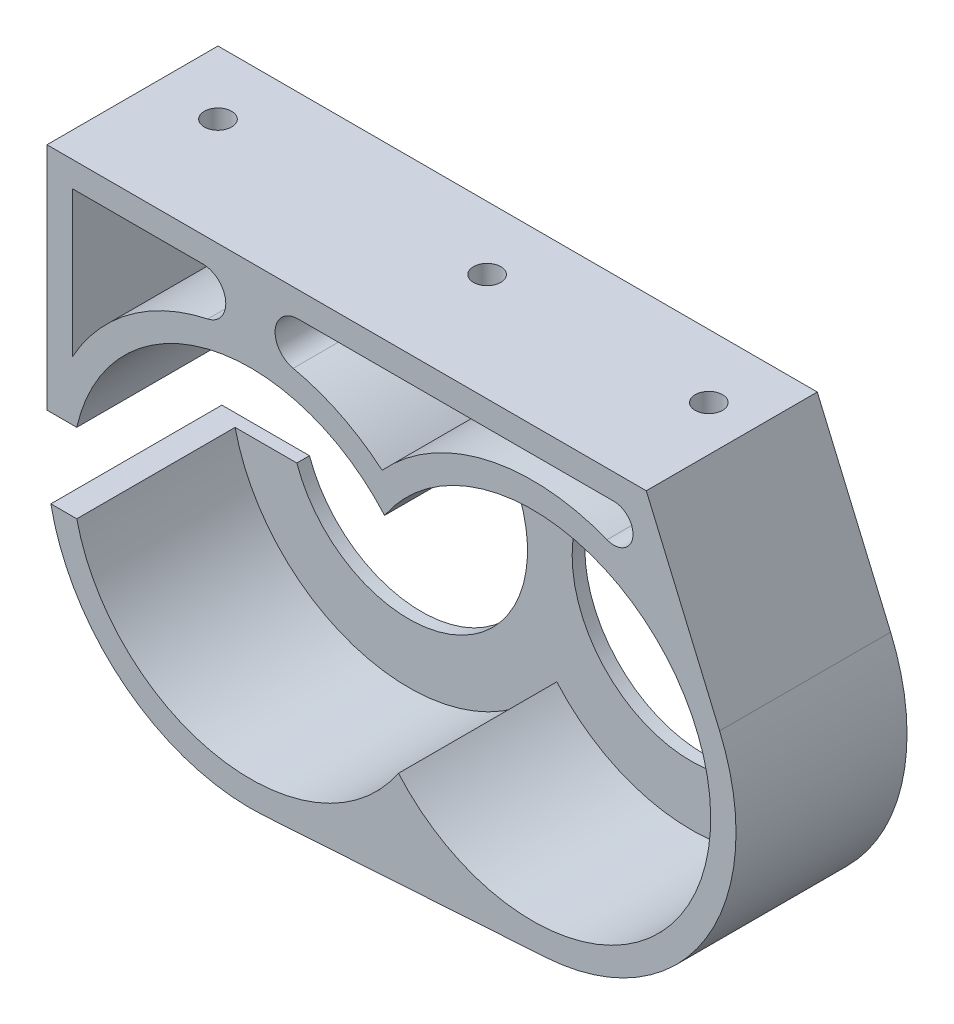
ISO-10303-21;
HEADER;
FILE_DESCRIPTION(('STEP AP214'),'2;1');
FILE_NAME('part.step','',(''),(''),'','','');
FILE_SCHEMA(('AUTOMOTIVE_DESIGN { 1 0 10303 214 1 1 1 1 }'));
ENDSEC;
DATA;
#1=APPLICATION_CONTEXT('core data for automotive mechanical design processes');
#2=APPLICATION_PROTOCOL_DEFINITION('international standard','automotive_design',2000,#1);
#3=PRODUCT_CONTEXT('',#1,'mechanical');
#4=PRODUCT('Part','Part','',(#3));
#5=PRODUCT_RELATED_PRODUCT_CATEGORY('part','',(#4));
#6=PRODUCT_DEFINITION_FORMATION('','',#4);
#7=PRODUCT_DEFINITION_CONTEXT('part definition',#1,'design');
#8=PRODUCT_DEFINITION('design','',#6,#7);
#9=PRODUCT_DEFINITION_SHAPE('','',#8);
#10=(LENGTH_UNIT() NAMED_UNIT(*) SI_UNIT(.MILLI.,.METRE.));
#11=(NAMED_UNIT(*) PLANE_ANGLE_UNIT() SI_UNIT($,.RADIAN.));
#12=(NAMED_UNIT(*) SI_UNIT($,.STERADIAN.) SOLID_ANGLE_UNIT());
#13=UNCERTAINTY_MEASURE_WITH_UNIT(LENGTH_MEASURE(1.E-05),#10,'distance_accuracy_value','');
#14=(GEOMETRIC_REPRESENTATION_CONTEXT(3) GLOBAL_UNCERTAINTY_ASSIGNED_CONTEXT((#13)) GLOBAL_UNIT_ASSIGNED_CONTEXT((#10,
#11,#12)) REPRESENTATION_CONTEXT('',''));
#15=CARTESIAN_POINT('',(0.,0.,0.));
#16=DIRECTION('',(0.,0.,1.));
#17=DIRECTION('',(1.,0.,0.));
#18=AXIS2_PLACEMENT_3D('',#15,#16,#17);
#19=CARTESIAN_POINT('',(0.,0.,20.));
#20=DIRECTION('',(0.,0.,-1.));
#21=DIRECTION('',(-1.,0.,0.));
#22=AXIS2_PLACEMENT_3D('',#19,#20,#21);
#23=CYLINDRICAL_SURFACE('',#22,22.5);
#24=DIRECTION('',(0.,0.,-1.));
#25=VECTOR('',#24,1.);
#26=CARTESIAN_POINT('',(-21.9374109684803,-4.99999999999999,20.));
#27=LINE('',#26,#25);
#28=CARTESIAN_POINT('',(-21.9374109684803,-4.99999999999999,0.));
#29=VERTEX_POINT('',#28);
#30=CARTESIAN_POINT('',(-21.9374109684803,-4.99999999999999,20.));
#31=VERTEX_POINT('',#30);
#32=EDGE_CURVE('E517',#29,#31,#27,.F.);
#33=ORIENTED_EDGE('',*,*,#32,.T.);
#34=CARTESIAN_POINT('',(0.,0.,20.));
#35=DIRECTION('',(0.,0.,1.));
#36=DIRECTION('',(1.,0.,0.));
#37=AXIS2_PLACEMENT_3D('',#34,#35,#36);
#38=CIRCLE('',#37,22.5);
#39=CARTESIAN_POINT('',(18.6946924526454,-12.520322443971,20.));
#40=VERTEX_POINT('',#39);
#41=EDGE_CURVE('E415',#31,#40,#38,.T.);
#42=ORIENTED_EDGE('',*,*,#41,.T.);
#43=DIRECTION('',(0.,0.,-1.));
#44=VECTOR('',#43,1.);
#45=CARTESIAN_POINT('',(18.6946924526454,-12.520322443971,20.));
#46=LINE('',#45,#44);
#47=CARTESIAN_POINT('',(18.6946924526454,-12.520322443971,0.));
#48=VERTEX_POINT('',#47);
#49=EDGE_CURVE('E350',#40,#48,#46,.T.);
#50=ORIENTED_EDGE('',*,*,#49,.T.);
#51=CARTESIAN_POINT('',(0.,0.,0.));
#52=DIRECTION('',(0.,0.,1.));
#53=DIRECTION('',(1.,0.,0.));
#54=AXIS2_PLACEMENT_3D('',#51,#52,#53);
#55=CIRCLE('',#54,22.5);
#56=EDGE_CURVE('E368',#29,#48,#55,.T.);
#57=ORIENTED_EDGE('',*,*,#56,.F.);
#58=EDGE_LOOP('',(#33,#42,#50,#57));
#59=FACE_BOUND('',#58,.T.);
#60=ADVANCED_FACE('F47',(#59),#23,.F.);
#61=CARTESIAN_POINT('',(0.,0.,20.));
#62=DIRECTION('',(0.,0.,1.));
#63=DIRECTION('',(1.,0.,0.));
#64=AXIS2_PLACEMENT_3D('',#61,#62,#63);
#65=PLANE('',#64);
#66=DIRECTION('',(-1.,0.,0.));
#67=VECTOR('',#66,1.);
#68=CARTESIAN_POINT('',(0.,-5.,20.));
#69=LINE('',#68,#67);
#70=CARTESIAN_POINT('',(-25.2089269902549,-4.99999999999999,20.));
#71=VERTEX_POINT('',#70);
#72=EDGE_CURVE('E553',#31,#71,#69,.T.);
#73=ORIENTED_EDGE('',*,*,#72,.T.);
#74=CARTESIAN_POINT('',(0.,0.,20.));
#75=DIRECTION('',(0.,0.,1.));
#76=DIRECTION('',(1.,0.,0.));
#77=AXIS2_PLACEMENT_3D('',#74,#75,#76);
#78=CIRCLE('',#77,25.7);
#79=CARTESIAN_POINT('',(1.64559871785401,-25.6472611570865,20.));
#80=VERTEX_POINT('',#79);
#81=EDGE_CURVE('E423',#71,#80,#78,.T.);
#82=ORIENTED_EDGE('',*,*,#81,.T.);
#83=DIRECTION('',(-0.997947904945,-0.0640310785157203,0.));
#84=VECTOR('',#83,1.);
#85=CARTESIAN_POINT('',(1.64559871785401,-25.6472611570865,20.));
#86=LINE('',#85,#84);
#87=CARTESIAN_POINT('',(37.281598717854,-23.360757520294,20.));
#88=VERTEX_POINT('',#87);
#89=EDGE_CURVE('E427',#88,#80,#86,.T.);
#90=ORIENTED_EDGE('',*,*,#89,.F.);
#91=CARTESIAN_POINT('',(35.636,2.28650363679251,20.));
#92=DIRECTION('',(0.,0.,1.));
#93=DIRECTION('',(1.,0.,0.));
#94=AXIS2_PLACEMENT_3D('',#91,#92,#93);
#95=CIRCLE('',#94,25.7);
#96=CARTESIAN_POINT('',(59.2620434294652,12.40085343641,20.));
#97=VERTEX_POINT('',#96);
#98=EDGE_CURVE('E434',#88,#97,#95,.T.);
#99=ORIENTED_EDGE('',*,*,#98,.T.);
#100=DIRECTION('',(-0.393554466911185,0.919301300757403,0.));
#101=VECTOR('',#100,1.);
#102=CARTESIAN_POINT('',(54.5698032374247,23.3614265582556,20.));
#103=LINE('',#102,#101);
#104=CARTESIAN_POINT('',(49.9999999999999,34.036,20.));
#105=VERTEX_POINT('',#104);
#106=EDGE_CURVE('E437',#97,#105,#103,.T.);
#107=ORIENTED_EDGE('',*,*,#106,.T.);
#108=DIRECTION('',(1.,0.,0.));
#109=VECTOR('',#108,1.);
#110=CARTESIAN_POINT('',(0.,34.036,20.));
#111=LINE('',#110,#109);
#112=CARTESIAN_POINT('',(-25.7,34.036,20.));
#113=VERTEX_POINT('',#112);
#114=EDGE_CURVE('E351',#113,#105,#111,.T.);
#115=ORIENTED_EDGE('',*,*,#114,.F.);
#116=DIRECTION('',(0.,-1.,0.));
#117=VECTOR('',#116,1.);
#118=CARTESIAN_POINT('',(-25.7,0.,20.));
#119=LINE('',#118,#117);
#120=CARTESIAN_POINT('',(-25.7,5.,20.));
#121=VERTEX_POINT('',#120);
#122=EDGE_CURVE('E414',#113,#121,#119,.T.);
#123=ORIENTED_EDGE('',*,*,#122,.T.);
#124=DIRECTION('',(1.,0.,0.));
#125=VECTOR('',#124,1.);
#126=CARTESIAN_POINT('',(-25.7,5.,20.));
#127=LINE('',#126,#125);
#128=CARTESIAN_POINT('',(-21.9374109684803,5.,20.));
#129=VERTEX_POINT('',#128);
#130=EDGE_CURVE('E393',#121,#129,#127,.T.);
#131=ORIENTED_EDGE('',*,*,#130,.T.);
#132=CARTESIAN_POINT('',(16.9413075473542,14.8068260807629,20.));
#133=VERTEX_POINT('',#132);
#134=EDGE_CURVE('E410',#133,#129,#38,.T.);
#135=ORIENTED_EDGE('',*,*,#134,.F.);
#136=CARTESIAN_POINT('',(35.636,2.28650363679251,20.));
#137=DIRECTION('',(0.,0.,1.));
#138=DIRECTION('',(1.,0.,0.));
#139=AXIS2_PLACEMENT_3D('',#136,#137,#138);
#140=CIRCLE('',#139,22.5000000000003);
#141=EDGE_CURVE('E367',#40,#133,#140,.T.);
#142=ORIENTED_EDGE('',*,*,#141,.F.);
#143=ORIENTED_EDGE('',*,*,#41,.F.);
#144=EDGE_LOOP('',(#73,#82,#90,#99,#107,#115,#123,#131,#135,#142,#143));
#145=FACE_BOUND('',#144,.T.);
#146=CARTESIAN_POINT('',(35.6359999999999,2.28650363679251,20.));
#147=DIRECTION('',(0.,0.,1.));
#148=DIRECTION('',(1.,0.,0.));
#149=AXIS2_PLACEMENT_3D('',#146,#147,#148);
#150=CIRCLE('',#149,25.7000000000003);
#151=CARTESIAN_POINT('',(45.0440158622167,26.2025910579468,20.));
#152=VERTEX_POINT('',#151);
#153=CARTESIAN_POINT('',(16.6343740371481,19.5904977065988,20.));
#154=VERTEX_POINT('',#153);
#155=EDGE_CURVE('E586',#152,#154,#150,.T.);
#156=ORIENTED_EDGE('',*,*,#155,.T.);
#157=CARTESIAN_POINT('',(0.,0.,20.));
#158=DIRECTION('',(0.,0.,1.));
#159=DIRECTION('',(1.,0.,0.));
#160=AXIS2_PLACEMENT_3D('',#157,#158,#159);
#161=CIRCLE('',#160,25.7);
#162=CARTESIAN_POINT('',(5.39417699902875,25.1275318028482,20.));
#163=VERTEX_POINT('',#162);
#164=EDGE_CURVE('E581',#154,#163,#161,.T.);
#165=ORIENTED_EDGE('',*,*,#164,.T.);
#166=CARTESIAN_POINT('',(6.00000000000002,27.9496187915664,20.));
#167=DIRECTION('',(0.,0.,1.));
#168=DIRECTION('',(1.,0.,0.));
#169=AXIS2_PLACEMENT_3D('',#166,#167,#168);
#170=CIRCLE('',#169,2.88638120843358);
#171=CARTESIAN_POINT('',(6.00000000000001,30.836,20.));
#172=VERTEX_POINT('',#171);
#173=EDGE_CURVE('E291',#172,#163,#170,.T.);
#174=ORIENTED_EDGE('',*,*,#173,.F.);
#175=DIRECTION('',(-1.,0.,0.));
#176=VECTOR('',#175,1.);
#177=CARTESIAN_POINT('',(0.,30.836,20.));
#178=LINE('',#177,#176);
#179=CARTESIAN_POINT('',(45.9225854368984,30.8360000000001,20.));
#180=VERTEX_POINT('',#179);
#181=EDGE_CURVE('E599',#180,#172,#178,.T.);
#182=ORIENTED_EDGE('',*,*,#181,.F.);
#183=CARTESIAN_POINT('',(45.9225854368984,28.4360000000001,20.));
#184=DIRECTION('',(0.,0.,1.));
#185=DIRECTION('',(1.,0.,0.));
#186=AXIS2_PLACEMENT_3D('',#183,#184,#185);
#187=CIRCLE('',#186,2.4);
#188=EDGE_CURVE('E676',#180,#152,#187,.F.);
#189=ORIENTED_EDGE('',*,*,#188,.T.);
#190=EDGE_LOOP('',(#156,#165,#174,#182,#189));
#191=FACE_BOUND('',#190,.T.);
#192=CARTESIAN_POINT('',(-5.99999999999998,27.9496187915664,20.));
#193=DIRECTION('',(0.,0.,1.));
#194=DIRECTION('',(1.,0.,0.));
#195=AXIS2_PLACEMENT_3D('',#192,#193,#194);
#196=CIRCLE('',#195,2.88638120843361);
#197=CARTESIAN_POINT('',(-5.99999999999999,30.8360000000001,20.));
#198=VERTEX_POINT('',#197);
#199=CARTESIAN_POINT('',(-5.39417699902872,25.1275318028482,20.));
#200=VERTEX_POINT('',#199);
#201=EDGE_CURVE('E636',#198,#200,#196,.F.);
#202=ORIENTED_EDGE('',*,*,#201,.T.);
#203=CARTESIAN_POINT('',(0.,0.,20.));
#204=DIRECTION('',(0.,0.,1.));
#205=DIRECTION('',(1.,0.,0.));
#206=AXIS2_PLACEMENT_3D('',#203,#204,#205);
#207=CIRCLE('',#206,25.7);
#208=CARTESIAN_POINT('',(-22.5,12.419339757008,20.));
#209=VERTEX_POINT('',#208);
#210=EDGE_CURVE('E631',#200,#209,#207,.T.);
#211=ORIENTED_EDGE('',*,*,#210,.T.);
#212=DIRECTION('',(0.,-1.,0.));
#213=VECTOR('',#212,1.);
#214=CARTESIAN_POINT('',(-22.5,0.,20.));
#215=LINE('',#214,#213);
#216=CARTESIAN_POINT('',(-22.5,30.836,20.));
#217=VERTEX_POINT('',#216);
#218=EDGE_CURVE('E640',#217,#209,#215,.T.);
#219=ORIENTED_EDGE('',*,*,#218,.F.);
#220=DIRECTION('',(-1.,0.,0.));
#221=VECTOR('',#220,1.);
#222=CARTESIAN_POINT('',(-1.29456311047789E-13,30.8360000000001,20.));
#223=LINE('',#222,#221);
#224=EDGE_CURVE('E645',#198,#217,#223,.T.);
#225=ORIENTED_EDGE('',*,*,#224,.F.);
#226=EDGE_LOOP('',(#202,#211,#219,#225));
#227=FACE_BOUND('',#226,.T.);
#228=ADVANCED_FACE('F453',(#145,#191,#227),#65,.T.);
#229=CARTESIAN_POINT('',(0.,0.,-1.6));
#230=DIRECTION('',(0.,0.,-1.));
#231=DIRECTION('',(-1.,0.,0.));
#232=AXIS2_PLACEMENT_3D('',#229,#230,#231);
#233=PLANE('',#232);
#234=CARTESIAN_POINT('',(35.636000000002,2.28650363678922,-1.6));
#235=DIRECTION('',(0.,0.,-1.));
#236=DIRECTION('',(-1.,0.,0.));
#237=AXIS2_PLACEMENT_3D('',#234,#235,#236);
#238=CIRCLE('',#237,15.);
#239=CARTESIAN_POINT('',(20.636000000002,2.28650363678922,-1.6));
#240=VERTEX_POINT('',#239);
#241=EDGE_CURVE('E795',#240,#240,#238,.T.);
#242=ORIENTED_EDGE('',*,*,#241,.F.);
#243=EDGE_LOOP('',(#242));
#244=FACE_BOUND('',#243,.T.);
#245=CARTESIAN_POINT('',(0.,0.,-1.6));
#246=DIRECTION('',(0.,0.,-1.));
#247=DIRECTION('',(-1.,0.,0.));
#248=AXIS2_PLACEMENT_3D('',#245,#246,#247);
#249=CIRCLE('',#248,15.);
#250=CARTESIAN_POINT('',(-14.142135623731,5.,-1.6));
#251=VERTEX_POINT('',#250);
#252=CARTESIAN_POINT('',(-14.142135623731,-5.,-1.6));
#253=VERTEX_POINT('',#252);
#254=EDGE_CURVE('E535',#251,#253,#249,.T.);
#255=ORIENTED_EDGE('',*,*,#254,.F.);
#256=DIRECTION('',(1.,0.,0.));
#257=VECTOR('',#256,1.);
#258=CARTESIAN_POINT('',(-25.7,5.,-1.6));
#259=LINE('',#258,#257);
#260=CARTESIAN_POINT('',(-25.7,5.,-1.6));
#261=VERTEX_POINT('',#260);
#262=EDGE_CURVE('E529',#261,#251,#259,.T.);
#263=ORIENTED_EDGE('',*,*,#262,.F.);
#264=DIRECTION('',(0.,1.,0.));
#265=VECTOR('',#264,1.);
#266=CARTESIAN_POINT('',(-25.7,0.,-1.6));
#267=LINE('',#266,#265);
#268=CARTESIAN_POINT('',(-25.7,34.036,-1.6));
#269=VERTEX_POINT('',#268);
#270=EDGE_CURVE('E475',#261,#269,#267,.T.);
#271=ORIENTED_EDGE('',*,*,#270,.T.);
#272=DIRECTION('',(1.,0.,0.));
#273=VECTOR('',#272,1.);
#274=CARTESIAN_POINT('',(-25.7,34.036,-1.6));
#275=LINE('',#274,#273);
#276=CARTESIAN_POINT('',(49.9999999999999,34.036,-1.6));
#277=VERTEX_POINT('',#276);
#278=EDGE_CURVE('E469',#269,#277,#275,.T.);
#279=ORIENTED_EDGE('',*,*,#278,.T.);
#280=DIRECTION('',(0.393554466911185,-0.919301300757403,0.));
#281=VECTOR('',#280,1.);
#282=CARTESIAN_POINT('',(49.9999999999999,34.036,-1.6));
#283=LINE('',#282,#281);
#284=CARTESIAN_POINT('',(59.2620434294652,12.40085343641,-1.6));
#285=VERTEX_POINT('',#284);
#286=EDGE_CURVE('E463',#277,#285,#283,.T.);
#287=ORIENTED_EDGE('',*,*,#286,.T.);
#288=CARTESIAN_POINT('',(35.636000000002,2.28650363678922,-1.6));
#289=DIRECTION('',(0.,0.,-1.));
#290=DIRECTION('',(-1.,0.,0.));
#291=AXIS2_PLACEMENT_3D('',#288,#289,#290);
#292=CIRCLE('',#291,25.6999999999997);
#293=CARTESIAN_POINT('',(37.2815987178535,-23.3607575202972,-1.6));
#294=VERTEX_POINT('',#293);
#295=EDGE_CURVE('E468',#285,#294,#292,.T.);
#296=ORIENTED_EDGE('',*,*,#295,.T.);
#297=DIRECTION('',(-0.997947904945006,-0.0640310785156249,0.));
#298=VECTOR('',#297,1.);
#299=CARTESIAN_POINT('',(37.2815987178535,-23.3607575202974,-1.6));
#300=LINE('',#299,#298);
#301=CARTESIAN_POINT('',(1.64559871785156,-25.6472611570866,-1.6));
#302=VERTEX_POINT('',#301);
#303=EDGE_CURVE('E473',#294,#302,#300,.T.);
#304=ORIENTED_EDGE('',*,*,#303,.T.);
#305=CARTESIAN_POINT('',(0.,0.,-1.6));
#306=DIRECTION('',(0.,0.,-1.));
#307=DIRECTION('',(-1.,0.,0.));
#308=AXIS2_PLACEMENT_3D('',#305,#306,#307);
#309=CIRCLE('',#308,25.7);
#310=CARTESIAN_POINT('',(-25.2089269902549,-4.99999999999999,-1.6));
#311=VERTEX_POINT('',#310);
#312=EDGE_CURVE('E697',#302,#311,#309,.T.);
#313=ORIENTED_EDGE('',*,*,#312,.T.);
#314=DIRECTION('',(-1.,0.,0.));
#315=VECTOR('',#314,1.);
#316=CARTESIAN_POINT('',(0.,-5.,-1.6));
#317=LINE('',#316,#315);
#318=EDGE_CURVE('E552',#253,#311,#317,.T.);
#319=ORIENTED_EDGE('',*,*,#318,.F.);
#320=EDGE_LOOP('',(#255,#263,#271,#279,#287,#296,#304,#313,#319));
#321=FACE_BOUND('',#320,.T.);
#322=CARTESIAN_POINT('',(6.00000000000002,27.9496187915664,-1.6));
#323=DIRECTION('',(0.,0.,-1.));
#324=DIRECTION('',(-1.,0.,0.));
#325=AXIS2_PLACEMENT_3D('',#322,#323,#324);
#326=CIRCLE('',#325,2.88638120843358);
#327=CARTESIAN_POINT('',(6.00000000000001,30.836,-1.6));
#328=VERTEX_POINT('',#327);
#329=CARTESIAN_POINT('',(5.39417699902875,25.1275318028482,-1.6));
#330=VERTEX_POINT('',#329);
#331=EDGE_CURVE('E573',#328,#330,#326,.F.);
#332=ORIENTED_EDGE('',*,*,#331,.T.);
#333=CARTESIAN_POINT('',(0.,0.,-1.6));
#334=DIRECTION('',(0.,0.,-1.));
#335=DIRECTION('',(-1.,0.,0.));
#336=AXIS2_PLACEMENT_3D('',#333,#334,#335);
#337=CIRCLE('',#336,25.7);
#338=CARTESIAN_POINT('',(16.6343740371481,19.5904977065988,-1.6));
#339=VERTEX_POINT('',#338);
#340=EDGE_CURVE('E577',#339,#330,#337,.F.);
#341=ORIENTED_EDGE('',*,*,#340,.F.);
#342=CARTESIAN_POINT('',(35.6359999999999,2.28650363679251,-1.6));
#343=DIRECTION('',(0.,0.,-1.));
#344=DIRECTION('',(-1.,0.,0.));
#345=AXIS2_PLACEMENT_3D('',#342,#343,#344);
#346=CIRCLE('',#345,25.7000000000003);
#347=CARTESIAN_POINT('',(45.0440158622167,26.2025910579468,-1.6));
#348=VERTEX_POINT('',#347);
#349=EDGE_CURVE('E602',#348,#339,#346,.F.);
#350=ORIENTED_EDGE('',*,*,#349,.F.);
#351=CARTESIAN_POINT('',(45.9225854368984,28.4360000000001,-1.6));
#352=DIRECTION('',(0.,0.,-1.));
#353=DIRECTION('',(-1.,0.,0.));
#354=AXIS2_PLACEMENT_3D('',#351,#352,#353);
#355=CIRCLE('',#354,2.4);
#356=CARTESIAN_POINT('',(45.9225854368984,30.8360000000001,-1.6));
#357=VERTEX_POINT('',#356);
#358=EDGE_CURVE('E398',#357,#348,#355,.T.);
#359=ORIENTED_EDGE('',*,*,#358,.F.);
#360=DIRECTION('',(-1.,0.,0.));
#361=VECTOR('',#360,1.);
#362=CARTESIAN_POINT('',(0.,30.836,-1.6));
#363=LINE('',#362,#361);
#364=EDGE_CURVE('E271',#357,#328,#363,.T.);
#365=ORIENTED_EDGE('',*,*,#364,.T.);
#366=EDGE_LOOP('',(#332,#341,#350,#359,#365));
#367=FACE_BOUND('',#366,.T.);
#368=DIRECTION('',(0.,-1.,0.));
#369=VECTOR('',#368,1.);
#370=CARTESIAN_POINT('',(-22.5,0.,-1.6));
#371=LINE('',#370,#369);
#372=CARTESIAN_POINT('',(-22.5,30.836,-1.6));
#373=VERTEX_POINT('',#372);
#374=CARTESIAN_POINT('',(-22.5,12.419339757008,-1.6));
#375=VERTEX_POINT('',#374);
#376=EDGE_CURVE('E622',#373,#375,#371,.T.);
#377=ORIENTED_EDGE('',*,*,#376,.T.);
#378=CARTESIAN_POINT('',(0.,0.,-1.6));
#379=DIRECTION('',(0.,0.,-1.));
#380=DIRECTION('',(-1.,0.,0.));
#381=AXIS2_PLACEMENT_3D('',#378,#379,#380);
#382=CIRCLE('',#381,25.7);
#383=CARTESIAN_POINT('',(-5.39417699902872,25.1275318028482,-1.6));
#384=VERTEX_POINT('',#383);
#385=EDGE_CURVE('E627',#384,#375,#382,.F.);
#386=ORIENTED_EDGE('',*,*,#385,.F.);
#387=CARTESIAN_POINT('',(-5.99999999999998,27.9496187915664,-1.6));
#388=DIRECTION('',(0.,0.,-1.));
#389=DIRECTION('',(-1.,0.,0.));
#390=AXIS2_PLACEMENT_3D('',#387,#388,#389);
#391=CIRCLE('',#390,2.88638120843361);
#392=CARTESIAN_POINT('',(-5.99999999999999,30.836,-1.6));
#393=VERTEX_POINT('',#392);
#394=EDGE_CURVE('E567',#393,#384,#391,.T.);
#395=ORIENTED_EDGE('',*,*,#394,.F.);
#396=DIRECTION('',(-1.,0.,0.));
#397=VECTOR('',#396,1.);
#398=CARTESIAN_POINT('',(-1.29456311047789E-13,30.8360000000001,-1.6));
#399=LINE('',#398,#397);
#400=EDGE_CURVE('E399',#393,#373,#399,.T.);
#401=ORIENTED_EDGE('',*,*,#400,.T.);
#402=EDGE_LOOP('',(#377,#386,#395,#401));
#403=FACE_BOUND('',#402,.T.);
#404=ADVANCED_FACE('F693',(#244,#321,#367,#403),#233,.T.);
#405=CARTESIAN_POINT('',(-25.7,0.,20.));
#406=DIRECTION('',(1.,0.,0.));
#407=DIRECTION('',(0.,1.,0.));
#408=AXIS2_PLACEMENT_3D('',#405,#406,#407);
#409=PLANE('',#408);
#410=ORIENTED_EDGE('',*,*,#270,.F.);
#411=DIRECTION('',(0.,0.,-1.));
#412=VECTOR('',#411,1.);
#413=CARTESIAN_POINT('',(-25.7,5.,20.001));
#414=LINE('',#413,#412);
#415=EDGE_CURVE('E386',#121,#261,#414,.T.);
#416=ORIENTED_EDGE('',*,*,#415,.F.);
#417=ORIENTED_EDGE('',*,*,#122,.F.);
#418=DIRECTION('',(0.,0.,-1.));
#419=VECTOR('',#418,1.);
#420=CARTESIAN_POINT('',(-25.7,34.036,20.));
#421=LINE('',#420,#419);
#422=EDGE_CURVE('E330',#113,#269,#421,.T.);
#423=ORIENTED_EDGE('',*,*,#422,.T.);
#424=EDGE_LOOP('',(#410,#416,#417,#423));
#425=FACE_BOUND('',#424,.T.);
#426=ADVANCED_FACE('F704',(#425),#409,.F.);
#427=CARTESIAN_POINT('',(0.,0.,20.));
#428=DIRECTION('',(0.,0.,-1.));
#429=DIRECTION('',(-1.,0.,0.));
#430=AXIS2_PLACEMENT_3D('',#427,#428,#429);
#431=CYLINDRICAL_SURFACE('',#430,25.7);
#432=ORIENTED_EDGE('',*,*,#81,.F.);
#433=DIRECTION('',(0.,0.,-1.));
#434=VECTOR('',#433,1.);
#435=CARTESIAN_POINT('',(-25.2089269902549,-4.99999999999999,20.001));
#436=LINE('',#435,#434);
#437=EDGE_CURVE('E385',#71,#311,#436,.T.);
#438=ORIENTED_EDGE('',*,*,#437,.T.);
#439=ORIENTED_EDGE('',*,*,#312,.F.);
#440=DIRECTION('',(0.,0.,-1.));
#441=VECTOR('',#440,1.);
#442=CARTESIAN_POINT('',(1.64559871785401,-25.6472611570865,20.));
#443=LINE('',#442,#441);
#444=EDGE_CURVE('E58',#80,#302,#443,.T.);
#445=ORIENTED_EDGE('',*,*,#444,.F.);
#446=EDGE_LOOP('',(#432,#438,#439,#445));
#447=FACE_BOUND('',#446,.T.);
#448=ADVANCED_FACE('F713',(#447),#431,.T.);
#449=CARTESIAN_POINT('',(1.64559871785401,-25.6472611570865,20.));
#450=DIRECTION('',(0.0640310785157202,-0.997947904944999,0.));
#451=DIRECTION('',(0.997947904945,0.0640310785157202,0.));
#452=AXIS2_PLACEMENT_3D('',#449,#450,#451);
#453=PLANE('',#452);
#454=ORIENTED_EDGE('',*,*,#444,.T.);
#455=ORIENTED_EDGE('',*,*,#303,.F.);
#456=DIRECTION('',(0.,0.,-1.));
#457=VECTOR('',#456,1.);
#458=CARTESIAN_POINT('',(37.281598717854,-23.360757520294,20.));
#459=LINE('',#458,#457);
#460=EDGE_CURVE('E336',#88,#294,#459,.T.);
#461=ORIENTED_EDGE('',*,*,#460,.F.);
#462=ORIENTED_EDGE('',*,*,#89,.T.);
#463=EDGE_LOOP('',(#454,#455,#461,#462));
#464=FACE_BOUND('',#463,.T.);
#465=ADVANCED_FACE('F754',(#464),#453,.T.);
#466=CARTESIAN_POINT('',(35.636,2.28650363679251,20.));
#467=DIRECTION('',(0.,0.,-1.));
#468=DIRECTION('',(-1.,0.,0.));
#469=AXIS2_PLACEMENT_3D('',#466,#467,#468);
#470=CYLINDRICAL_SURFACE('',#469,25.7);
#471=ORIENTED_EDGE('',*,*,#460,.T.);
#472=ORIENTED_EDGE('',*,*,#295,.F.);
#473=DIRECTION('',(0.,0.,-1.));
#474=VECTOR('',#473,1.);
#475=CARTESIAN_POINT('',(59.2620434294652,12.40085343641,20.));
#476=LINE('',#475,#474);
#477=EDGE_CURVE('E329',#97,#285,#476,.T.);
#478=ORIENTED_EDGE('',*,*,#477,.F.);
#479=ORIENTED_EDGE('',*,*,#98,.F.);
#480=EDGE_LOOP('',(#471,#472,#478,#479));
#481=FACE_BOUND('',#480,.T.);
#482=ADVANCED_FACE('F749',(#481),#470,.T.);
#483=CARTESIAN_POINT('',(54.5698032374247,23.3614265582556,20.));
#484=DIRECTION('',(-0.919301300757403,-0.393554466911185,0.));
#485=DIRECTION('',(0.393554466911185,-0.919301300757403,0.));
#486=AXIS2_PLACEMENT_3D('',#483,#484,#485);
#487=PLANE('',#486);
#488=ORIENTED_EDGE('',*,*,#477,.T.);
#489=ORIENTED_EDGE('',*,*,#286,.F.);
#490=DIRECTION('',(0.,0.,-1.));
#491=VECTOR('',#490,1.);
#492=CARTESIAN_POINT('',(49.9999999999999,34.036,20.));
#493=LINE('',#492,#491);
#494=EDGE_CURVE('E324',#105,#277,#493,.T.);
#495=ORIENTED_EDGE('',*,*,#494,.F.);
#496=ORIENTED_EDGE('',*,*,#106,.F.);
#497=EDGE_LOOP('',(#488,#489,#495,#496));
#498=FACE_BOUND('',#497,.T.);
#499=ADVANCED_FACE('F461',(#498),#487,.F.);
#500=CARTESIAN_POINT('',(35.636,2.28650363679251,20.));
#501=DIRECTION('',(0.,0.,-1.));
#502=DIRECTION('',(-1.,0.,0.));
#503=AXIS2_PLACEMENT_3D('',#500,#501,#502);
#504=CYLINDRICAL_SURFACE('',#503,22.5000000000003);
#505=CARTESIAN_POINT('',(35.636,2.28650363679251,0.));
#506=DIRECTION('',(0.,0.,1.));
#507=DIRECTION('',(1.,0.,0.));
#508=AXIS2_PLACEMENT_3D('',#505,#506,#507);
#509=CIRCLE('',#508,22.5000000000003);
#510=CARTESIAN_POINT('',(16.9413075473542,14.8068260807629,0.));
#511=VERTEX_POINT('',#510);
#512=EDGE_CURVE('E369',#48,#511,#509,.T.);
#513=ORIENTED_EDGE('',*,*,#512,.F.);
#514=ORIENTED_EDGE('',*,*,#49,.F.);
#515=ORIENTED_EDGE('',*,*,#141,.T.);
#516=DIRECTION('',(0.,0.,-1.));
#517=VECTOR('',#516,1.);
#518=CARTESIAN_POINT('',(16.9413075473542,14.8068260807629,20.));
#519=LINE('',#518,#517);
#520=EDGE_CURVE('E347',#133,#511,#519,.T.);
#521=ORIENTED_EDGE('',*,*,#520,.T.);
#522=EDGE_LOOP('',(#513,#514,#515,#521));
#523=FACE_BOUND('',#522,.T.);
#524=ADVANCED_FACE('F50',(#523),#504,.F.);
#525=DIRECTION('',(0.,0.,-1.));
#526=VECTOR('',#525,1.);
#527=CARTESIAN_POINT('',(-21.9374109684803,5.,20.));
#528=LINE('',#527,#526);
#529=CARTESIAN_POINT('',(-21.9374109684803,5.,0.));
#530=VERTEX_POINT('',#529);
#531=EDGE_CURVE('E384',#129,#530,#528,.T.);
#532=ORIENTED_EDGE('',*,*,#531,.T.);
#533=EDGE_CURVE('E362',#511,#530,#55,.T.);
#534=ORIENTED_EDGE('',*,*,#533,.F.);
#535=ORIENTED_EDGE('',*,*,#520,.F.);
#536=ORIENTED_EDGE('',*,*,#134,.T.);
#537=EDGE_LOOP('',(#532,#534,#535,#536));
#538=FACE_BOUND('',#537,.T.);
#539=ADVANCED_FACE('F524',(#538),#23,.F.);
#540=CARTESIAN_POINT('',(0.,34.036,20.));
#541=DIRECTION('',(0.,1.,0.));
#542=DIRECTION('',(0.,0.,1.));
#543=AXIS2_PLACEMENT_3D('',#540,#541,#542);
#544=PLANE('',#543);
#545=CARTESIAN_POINT('',(16.3,34.036,6.4));
#546=DIRECTION('',(0.,1.,0.));
#547=DIRECTION('',(0.,0.,1.));
#548=AXIS2_PLACEMENT_3D('',#545,#546,#547);
#549=CIRCLE('',#548,1.72719999999999);
#550=CARTESIAN_POINT('',(16.3,34.036,8.12719999999999));
#551=VERTEX_POINT('',#550);
#552=EDGE_CURVE('E614',#551,#551,#549,.T.);
#553=ORIENTED_EDGE('',*,*,#552,.F.);
#554=EDGE_LOOP('',(#553));
#555=FACE_BOUND('',#554,.T.);
#556=CARTESIAN_POINT('',(-17.7,34.036,6.40000000000001));
#557=DIRECTION('',(0.,1.,0.));
#558=DIRECTION('',(0.,0.,1.));
#559=AXIS2_PLACEMENT_3D('',#556,#557,#558);
#560=CIRCLE('',#559,1.72719999999999);
#561=CARTESIAN_POINT('',(-17.7,34.036,8.1272));
#562=VERTEX_POINT('',#561);
#563=EDGE_CURVE('E309',#562,#562,#560,.T.);
#564=ORIENTED_EDGE('',*,*,#563,.F.);
#565=EDGE_LOOP('',(#564));
#566=FACE_BOUND('',#565,.T.);
#567=CARTESIAN_POINT('',(44.3,34.036,6.4));
#568=DIRECTION('',(0.,1.,0.));
#569=DIRECTION('',(0.,0.,1.));
#570=AXIS2_PLACEMENT_3D('',#567,#568,#569);
#571=CIRCLE('',#570,1.72719999999998);
#572=CARTESIAN_POINT('',(44.3,34.036,8.12719999999998));
#573=VERTEX_POINT('',#572);
#574=EDGE_CURVE('E259',#573,#573,#571,.T.);
#575=ORIENTED_EDGE('',*,*,#574,.F.);
#576=EDGE_LOOP('',(#575));
#577=FACE_BOUND('',#576,.T.);
#578=ORIENTED_EDGE('',*,*,#494,.T.);
#579=ORIENTED_EDGE('',*,*,#278,.F.);
#580=ORIENTED_EDGE('',*,*,#422,.F.);
#581=ORIENTED_EDGE('',*,*,#114,.T.);
#582=EDGE_LOOP('',(#578,#579,#580,#581));
#583=FACE_BOUND('',#582,.T.);
#584=ADVANCED_FACE('F445',(#555,#566,#577,#583),#544,.T.);
#585=CARTESIAN_POINT('',(0.,0.,0.));
#586=DIRECTION('',(0.,0.,-1.));
#587=DIRECTION('',(-1.,0.,0.));
#588=AXIS2_PLACEMENT_3D('',#585,#586,#587);
#589=PLANE('',#588);
#590=CARTESIAN_POINT('',(35.636000000002,2.28650363678922,0.));
#591=DIRECTION('',(0.,0.,-1.));
#592=DIRECTION('',(-1.,0.,0.));
#593=AXIS2_PLACEMENT_3D('',#590,#591,#592);
#594=CIRCLE('',#593,15.);
#595=CARTESIAN_POINT('',(20.636000000002,2.28650363678922,0.));
#596=VERTEX_POINT('',#595);
#597=EDGE_CURVE('E539',#596,#596,#594,.F.);
#598=ORIENTED_EDGE('',*,*,#597,.F.);
#599=EDGE_LOOP('',(#598));
#600=FACE_BOUND('',#599,.T.);
#601=DIRECTION('',(-1.,0.,0.));
#602=VECTOR('',#601,1.);
#603=CARTESIAN_POINT('',(-25.7,5.,0.));
#604=LINE('',#603,#602);
#605=CARTESIAN_POINT('',(-14.142135623731,5.,0.));
#606=VERTEX_POINT('',#605);
#607=EDGE_CURVE('E380',#606,#530,#604,.T.);
#608=ORIENTED_EDGE('',*,*,#607,.F.);
#609=CARTESIAN_POINT('',(0.,0.,0.));
#610=DIRECTION('',(0.,0.,-1.));
#611=DIRECTION('',(-1.,0.,0.));
#612=AXIS2_PLACEMENT_3D('',#609,#610,#611);
#613=CIRCLE('',#612,15.);
#614=CARTESIAN_POINT('',(-14.142135623731,-5.,0.));
#615=VERTEX_POINT('',#614);
#616=EDGE_CURVE('E77',#615,#606,#613,.F.);
#617=ORIENTED_EDGE('',*,*,#616,.F.);
#618=DIRECTION('',(1.,0.,0.));
#619=VECTOR('',#618,1.);
#620=CARTESIAN_POINT('',(0.,-5.,0.));
#621=LINE('',#620,#619);
#622=EDGE_CURVE('E508',#29,#615,#621,.T.);
#623=ORIENTED_EDGE('',*,*,#622,.F.);
#624=ORIENTED_EDGE('',*,*,#56,.T.);
#625=ORIENTED_EDGE('',*,*,#512,.T.);
#626=ORIENTED_EDGE('',*,*,#533,.T.);
#627=EDGE_LOOP('',(#608,#617,#623,#624,#625,#626));
#628=FACE_BOUND('',#627,.T.);
#629=ADVANCED_FACE('F506',(#600,#628),#589,.F.);
#630=CARTESIAN_POINT('',(0.,0.,-1.601));
#631=DIRECTION('',(0.,0.,1.));
#632=DIRECTION('',(1.,0.,0.));
#633=AXIS2_PLACEMENT_3D('',#630,#631,#632);
#634=CYLINDRICAL_SURFACE('',#633,25.7);
#635=ORIENTED_EDGE('',*,*,#340,.T.);
#636=DIRECTION('',(0.,0.,1.));
#637=VECTOR('',#636,1.);
#638=CARTESIAN_POINT('',(5.39417699902875,25.1275318028482,-1.601));
#639=LINE('',#638,#637);
#640=EDGE_CURVE('E277',#330,#163,#639,.T.);
#641=ORIENTED_EDGE('',*,*,#640,.T.);
#642=ORIENTED_EDGE('',*,*,#164,.F.);
#643=DIRECTION('',(0.,0.,1.));
#644=VECTOR('',#643,1.);
#645=CARTESIAN_POINT('',(16.6343740371481,19.5904977065988,-1.601));
#646=LINE('',#645,#644);
#647=EDGE_CURVE('E285',#339,#154,#646,.T.);
#648=ORIENTED_EDGE('',*,*,#647,.F.);
#649=EDGE_LOOP('',(#635,#641,#642,#648));
#650=FACE_BOUND('',#649,.T.);
#651=ADVANCED_FACE('F688',(#650),#634,.T.);
#652=CARTESIAN_POINT('',(6.00000000000002,27.9496187915664,-1.601));
#653=DIRECTION('',(0.,0.,1.));
#654=DIRECTION('',(1.,0.,0.));
#655=AXIS2_PLACEMENT_3D('',#652,#653,#654);
#656=CYLINDRICAL_SURFACE('',#655,2.88638120843358);
#657=DIRECTION('',(0.,0.,1.));
#658=VECTOR('',#657,1.);
#659=CARTESIAN_POINT('',(6.00000000000001,30.836,-1.601));
#660=LINE('',#659,#658);
#661=EDGE_CURVE('E274',#328,#172,#660,.T.);
#662=ORIENTED_EDGE('',*,*,#661,.T.);
#663=ORIENTED_EDGE('',*,*,#173,.T.);
#664=ORIENTED_EDGE('',*,*,#640,.F.);
#665=ORIENTED_EDGE('',*,*,#331,.F.);
#666=EDGE_LOOP('',(#662,#663,#664,#665));
#667=FACE_BOUND('',#666,.T.);
#668=ADVANCED_FACE('F691',(#667),#656,.F.);
#669=CARTESIAN_POINT('',(0.,30.836,-1.601));
#670=DIRECTION('',(0.,1.,0.));
#671=DIRECTION('',(-1.,0.,0.));
#672=AXIS2_PLACEMENT_3D('',#669,#670,#671);
#673=PLANE('',#672);
#674=CARTESIAN_POINT('',(16.3,30.836,6.4));
#675=DIRECTION('',(0.,1.,0.));
#676=DIRECTION('',(-1.,0.,0.));
#677=AXIS2_PLACEMENT_3D('',#674,#675,#676);
#678=CIRCLE('',#677,1.72719999999999);
#679=CARTESIAN_POINT('',(14.5728,30.836,6.4));
#680=VERTEX_POINT('',#679);
#681=EDGE_CURVE('E610',#680,#680,#678,.T.);
#682=ORIENTED_EDGE('',*,*,#681,.T.);
#683=EDGE_LOOP('',(#682));
#684=FACE_BOUND('',#683,.T.);
#685=DIRECTION('',(0.,0.,1.));
#686=VECTOR('',#685,1.);
#687=CARTESIAN_POINT('',(45.9225854368984,30.8360000000001,-1.601));
#688=LINE('',#687,#686);
#689=CARTESIAN_POINT('',(45.9225854368984,30.8360000000001,5.80802336197685));
#690=VERTEX_POINT('',#689);
#691=EDGE_CURVE('E263',#357,#690,#688,.T.);
#692=ORIENTED_EDGE('',*,*,#691,.T.);
#693=CARTESIAN_POINT('',(44.3,30.8360000000001,6.4));
#694=DIRECTION('',(0.,1.,0.));
#695=DIRECTION('',(-1.,0.,0.));
#696=AXIS2_PLACEMENT_3D('',#693,#694,#695);
#697=CIRCLE('',#696,1.72719999999999);
#698=CARTESIAN_POINT('',(45.9225854368984,30.8360000000001,6.99197663802315));
#699=VERTEX_POINT('',#698);
#700=EDGE_CURVE('E12',#690,#699,#697,.T.);
#701=ORIENTED_EDGE('',*,*,#700,.T.);
#702=EDGE_CURVE('E266',#699,#180,#688,.T.);
#703=ORIENTED_EDGE('',*,*,#702,.T.);
#704=ORIENTED_EDGE('',*,*,#181,.T.);
#705=ORIENTED_EDGE('',*,*,#661,.F.);
#706=ORIENTED_EDGE('',*,*,#364,.F.);
#707=EDGE_LOOP('',(#692,#701,#703,#704,#705,#706));
#708=FACE_BOUND('',#707,.T.);
#709=ADVANCED_FACE('F269',(#684,#708),#673,.F.);
#710=CARTESIAN_POINT('',(45.9225854368984,28.4360000000001,-1.601));
#711=DIRECTION('',(0.,0.,1.));
#712=DIRECTION('',(1.,0.,0.));
#713=AXIS2_PLACEMENT_3D('',#710,#711,#712);
#714=CYLINDRICAL_SURFACE('',#713,2.4);
#715=ORIENTED_EDGE('',*,*,#358,.T.);
#716=DIRECTION('',(0.,0.,1.));
#717=VECTOR('',#716,1.);
#718=CARTESIAN_POINT('',(45.0440158622167,26.2025910579468,-1.601));
#719=LINE('',#718,#717);
#720=EDGE_CURVE('E282',#348,#152,#719,.T.);
#721=ORIENTED_EDGE('',*,*,#720,.T.);
#722=ORIENTED_EDGE('',*,*,#188,.F.);
#723=ORIENTED_EDGE('',*,*,#702,.F.);
#724=EDGE_CURVE('E256',#690,#699,#688,.T.);
#725=ORIENTED_EDGE('',*,*,#724,.F.);
#726=ORIENTED_EDGE('',*,*,#691,.F.);
#727=EDGE_LOOP('',(#715,#721,#722,#723,#725,#726));
#728=FACE_BOUND('',#727,.T.);
#729=ADVANCED_FACE('F262',(#728),#714,.F.);
#730=CARTESIAN_POINT('',(35.6359999999999,2.28650363679251,-1.601));
#731=DIRECTION('',(0.,0.,1.));
#732=DIRECTION('',(1.,0.,0.));
#733=AXIS2_PLACEMENT_3D('',#730,#731,#732);
#734=CYLINDRICAL_SURFACE('',#733,25.7000000000003);
#735=ORIENTED_EDGE('',*,*,#349,.T.);
#736=ORIENTED_EDGE('',*,*,#647,.T.);
#737=ORIENTED_EDGE('',*,*,#155,.F.);
#738=ORIENTED_EDGE('',*,*,#720,.F.);
#739=EDGE_LOOP('',(#735,#736,#737,#738));
#740=FACE_BOUND('',#739,.T.);
#741=ADVANCED_FACE('F684',(#740),#734,.T.);
#742=CARTESIAN_POINT('',(0.,0.,-1.601));
#743=DIRECTION('',(0.,0.,1.));
#744=DIRECTION('',(1.,0.,0.));
#745=AXIS2_PLACEMENT_3D('',#742,#743,#744);
#746=CYLINDRICAL_SURFACE('',#745,25.7);
#747=ORIENTED_EDGE('',*,*,#385,.T.);
#748=DIRECTION('',(0.,0.,1.));
#749=VECTOR('',#748,1.);
#750=CARTESIAN_POINT('',(-22.5,12.419339757008,-1.601));
#751=LINE('',#750,#749);
#752=EDGE_CURVE('E647',#375,#209,#751,.T.);
#753=ORIENTED_EDGE('',*,*,#752,.T.);
#754=ORIENTED_EDGE('',*,*,#210,.F.);
#755=DIRECTION('',(0.,0.,1.));
#756=VECTOR('',#755,1.);
#757=CARTESIAN_POINT('',(-5.39417699902872,25.1275318028482,-1.601));
#758=LINE('',#757,#756);
#759=EDGE_CURVE('E644',#384,#200,#758,.T.);
#760=ORIENTED_EDGE('',*,*,#759,.F.);
#761=EDGE_LOOP('',(#747,#753,#754,#760));
#762=FACE_BOUND('',#761,.T.);
#763=ADVANCED_FACE('F842',(#762),#746,.T.);
#764=CARTESIAN_POINT('',(-22.5,0.,-1.601));
#765=DIRECTION('',(-1.,0.,0.));
#766=DIRECTION('',(0.,-1.,0.));
#767=AXIS2_PLACEMENT_3D('',#764,#765,#766);
#768=PLANE('',#767);
#769=DIRECTION('',(0.,0.,1.));
#770=VECTOR('',#769,1.);
#771=CARTESIAN_POINT('',(-22.5,30.836,-1.601));
#772=LINE('',#771,#770);
#773=EDGE_CURVE('E651',#373,#217,#772,.T.);
#774=ORIENTED_EDGE('',*,*,#773,.T.);
#775=ORIENTED_EDGE('',*,*,#218,.T.);
#776=ORIENTED_EDGE('',*,*,#752,.F.);
#777=ORIENTED_EDGE('',*,*,#376,.F.);
#778=EDGE_LOOP('',(#774,#775,#776,#777));
#779=FACE_BOUND('',#778,.T.);
#780=ADVANCED_FACE('F838',(#779),#768,.F.);
#781=CARTESIAN_POINT('',(-1.29456311047789E-13,30.8360000000001,-1.601));
#782=DIRECTION('',(0.,1.,0.));
#783=DIRECTION('',(-1.,0.,0.));
#784=AXIS2_PLACEMENT_3D('',#781,#782,#783);
#785=PLANE('',#784);
#786=CARTESIAN_POINT('',(-17.7,30.836,6.40000000000001));
#787=DIRECTION('',(0.,1.,0.));
#788=DIRECTION('',(-1.,0.,0.));
#789=AXIS2_PLACEMENT_3D('',#786,#787,#788);
#790=CIRCLE('',#789,1.72719999999999);
#791=CARTESIAN_POINT('',(-19.4272,30.836,6.40000000000001));
#792=VERTEX_POINT('',#791);
#793=EDGE_CURVE('E303',#792,#792,#790,.T.);
#794=ORIENTED_EDGE('',*,*,#793,.T.);
#795=EDGE_LOOP('',(#794));
#796=FACE_BOUND('',#795,.T.);
#797=DIRECTION('',(0.,0.,1.));
#798=VECTOR('',#797,1.);
#799=CARTESIAN_POINT('',(-5.99999999999999,30.8360000000001,-1.601));
#800=LINE('',#799,#798);
#801=EDGE_CURVE('E654',#393,#198,#800,.T.);
#802=ORIENTED_EDGE('',*,*,#801,.T.);
#803=ORIENTED_EDGE('',*,*,#224,.T.);
#804=ORIENTED_EDGE('',*,*,#773,.F.);
#805=ORIENTED_EDGE('',*,*,#400,.F.);
#806=EDGE_LOOP('',(#802,#803,#804,#805));
#807=FACE_BOUND('',#806,.T.);
#808=ADVANCED_FACE('F667',(#796,#807),#785,.F.);
#809=CARTESIAN_POINT('',(-5.99999999999998,27.9496187915664,-1.601));
#810=DIRECTION('',(0.,0.,1.));
#811=DIRECTION('',(1.,0.,0.));
#812=AXIS2_PLACEMENT_3D('',#809,#810,#811);
#813=CYLINDRICAL_SURFACE('',#812,2.88638120843361);
#814=ORIENTED_EDGE('',*,*,#394,.T.);
#815=ORIENTED_EDGE('',*,*,#759,.T.);
#816=ORIENTED_EDGE('',*,*,#201,.F.);
#817=ORIENTED_EDGE('',*,*,#801,.F.);
#818=EDGE_LOOP('',(#814,#815,#816,#817));
#819=FACE_BOUND('',#818,.T.);
#820=ADVANCED_FACE('F672',(#819),#813,.F.);
#821=CARTESIAN_POINT('',(0.,-5.,20.001));
#822=DIRECTION('',(0.,-1.,0.));
#823=DIRECTION('',(1.,0.,0.));
#824=AXIS2_PLACEMENT_3D('',#821,#822,#823);
#825=PLANE('',#824);
#826=ORIENTED_EDGE('',*,*,#622,.T.);
#827=DIRECTION('',(0.,0.,-1.));
#828=VECTOR('',#827,1.);
#829=CARTESIAN_POINT('',(-14.142135623731,-5.,20.001));
#830=LINE('',#829,#828);
#831=EDGE_CURVE('E532',#253,#615,#830,.F.);
#832=ORIENTED_EDGE('',*,*,#831,.F.);
#833=ORIENTED_EDGE('',*,*,#318,.T.);
#834=ORIENTED_EDGE('',*,*,#437,.F.);
#835=ORIENTED_EDGE('',*,*,#72,.F.);
#836=ORIENTED_EDGE('',*,*,#32,.F.);
#837=EDGE_LOOP('',(#826,#832,#833,#834,#835,#836));
#838=FACE_BOUND('',#837,.T.);
#839=ADVANCED_FACE('F718',(#838),#825,.F.);
#840=CARTESIAN_POINT('',(-25.7,5.,20.001));
#841=DIRECTION('',(0.,1.,0.));
#842=DIRECTION('',(-1.,0.,0.));
#843=AXIS2_PLACEMENT_3D('',#840,#841,#842);
#844=PLANE('',#843);
#845=ORIENTED_EDGE('',*,*,#262,.T.);
#846=DIRECTION('',(0.,0.,-1.));
#847=VECTOR('',#846,1.);
#848=CARTESIAN_POINT('',(-14.142135623731,5.,20.001));
#849=LINE('',#848,#847);
#850=EDGE_CURVE('E258',#606,#251,#849,.T.);
#851=ORIENTED_EDGE('',*,*,#850,.F.);
#852=ORIENTED_EDGE('',*,*,#607,.T.);
#853=ORIENTED_EDGE('',*,*,#531,.F.);
#854=ORIENTED_EDGE('',*,*,#130,.F.);
#855=ORIENTED_EDGE('',*,*,#415,.T.);
#856=EDGE_LOOP('',(#845,#851,#852,#853,#854,#855));
#857=FACE_BOUND('',#856,.T.);
#858=ADVANCED_FACE('F527',(#857),#844,.F.);
#859=CARTESIAN_POINT('',(0.,0.,20.001));
#860=DIRECTION('',(0.,0.,-1.));
#861=DIRECTION('',(-1.,0.,0.));
#862=AXIS2_PLACEMENT_3D('',#859,#860,#861);
#863=CYLINDRICAL_SURFACE('',#862,15.);
#864=ORIENTED_EDGE('',*,*,#831,.T.);
#865=ORIENTED_EDGE('',*,*,#616,.T.);
#866=ORIENTED_EDGE('',*,*,#850,.T.);
#867=ORIENTED_EDGE('',*,*,#254,.T.);
#868=EDGE_LOOP('',(#864,#865,#866,#867));
#869=FACE_BOUND('',#868,.T.);
#870=ADVANCED_FACE('F719',(#869),#863,.F.);
#871=CARTESIAN_POINT('',(35.636000000002,2.28650363678922,20.001));
#872=DIRECTION('',(0.,0.,-1.));
#873=DIRECTION('',(-1.,0.,0.));
#874=AXIS2_PLACEMENT_3D('',#871,#872,#873);
#875=CYLINDRICAL_SURFACE('',#874,15.);
#876=ORIENTED_EDGE('',*,*,#241,.T.);
#877=EDGE_LOOP('',(#876));
#878=FACE_BOUND('',#877,.T.);
#879=ORIENTED_EDGE('',*,*,#597,.T.);
#880=EDGE_LOOP('',(#879));
#881=FACE_BOUND('',#880,.T.);
#882=ADVANCED_FACE('F721',(#878,#881),#875,.F.);
#883=CARTESIAN_POINT('',(0.,30.836,-1.601));
#884=DIRECTION('',(0.,1.,0.));
#885=DIRECTION('',(-1.,0.,0.));
#886=AXIS2_PLACEMENT_3D('',#883,#884,#885);
#887=PLANE('',#886);
#888=ORIENTED_EDGE('',*,*,#724,.T.);
#889=CARTESIAN_POINT('',(44.3,30.8360000000001,6.4));
#890=DIRECTION('',(0.,1.,0.));
#891=DIRECTION('',(-1.,0.,0.));
#892=AXIS2_PLACEMENT_3D('',#889,#890,#891);
#893=CIRCLE('',#892,1.72719999999999);
#894=EDGE_CURVE('E67',#690,#699,#893,.F.);
#895=ORIENTED_EDGE('',*,*,#894,.F.);
#896=EDGE_LOOP('',(#888,#895));
#897=FACE_BOUND('',#896,.T.);
#898=ADVANCED_FACE('F255',(#897),#887,.T.);
#899=CARTESIAN_POINT('',(44.3,34.036,6.4));
#900=DIRECTION('',(0.,1.,0.));
#901=DIRECTION('',(0.,0.,1.));
#902=AXIS2_PLACEMENT_3D('',#899,#900,#901);
#903=CYLINDRICAL_SURFACE('',#902,1.72719999999999);
#904=ORIENTED_EDGE('',*,*,#894,.T.);
#905=ORIENTED_EDGE('',*,*,#700,.F.);
#906=EDGE_LOOP('',(#904,#905));
#907=FACE_BOUND('',#906,.T.);
#908=ORIENTED_EDGE('',*,*,#574,.T.);
#909=EDGE_LOOP('',(#908));
#910=FACE_BOUND('',#909,.T.);
#911=ADVANCED_FACE('F248',(#907,#910),#903,.F.);
#912=CARTESIAN_POINT('',(-17.7,34.036,6.40000000000001));
#913=DIRECTION('',(0.,1.,0.));
#914=DIRECTION('',(0.,0.,1.));
#915=AXIS2_PLACEMENT_3D('',#912,#913,#914);
#916=CYLINDRICAL_SURFACE('',#915,1.72719999999999);
#917=ORIENTED_EDGE('',*,*,#793,.F.);
#918=EDGE_LOOP('',(#917));
#919=FACE_BOUND('',#918,.T.);
#920=ORIENTED_EDGE('',*,*,#563,.T.);
#921=EDGE_LOOP('',(#920));
#922=FACE_BOUND('',#921,.T.);
#923=ADVANCED_FACE('F807',(#919,#922),#916,.F.);
#924=CARTESIAN_POINT('',(16.3,34.036,6.4));
#925=DIRECTION('',(0.,1.,0.));
#926=DIRECTION('',(0.,0.,1.));
#927=AXIS2_PLACEMENT_3D('',#924,#925,#926);
#928=CYLINDRICAL_SURFACE('',#927,1.72719999999999);
#929=ORIENTED_EDGE('',*,*,#681,.F.);
#930=EDGE_LOOP('',(#929));
#931=FACE_BOUND('',#930,.T.);
#932=ORIENTED_EDGE('',*,*,#552,.T.);
#933=EDGE_LOOP('',(#932));
#934=FACE_BOUND('',#933,.T.);
#935=ADVANCED_FACE('F817',(#931,#934),#928,.F.);
#936=CLOSED_SHELL('',(#60,#228,#404,#426,#448,#465,#482,#499,#524,#539,#584,#629,#651,#668,#709,
#729,#741,#763,#780,#808,#820,#839,#858,#870,#882,#898,#911,#923,#935));
#937=MANIFOLD_SOLID_BREP('B2',#936);
#938=ADVANCED_BREP_SHAPE_REPRESENTATION('',(#18,#937),#14);
#939=SHAPE_DEFINITION_REPRESENTATION(#9,#938);
ENDSEC;
END-ISO-10303-21;
